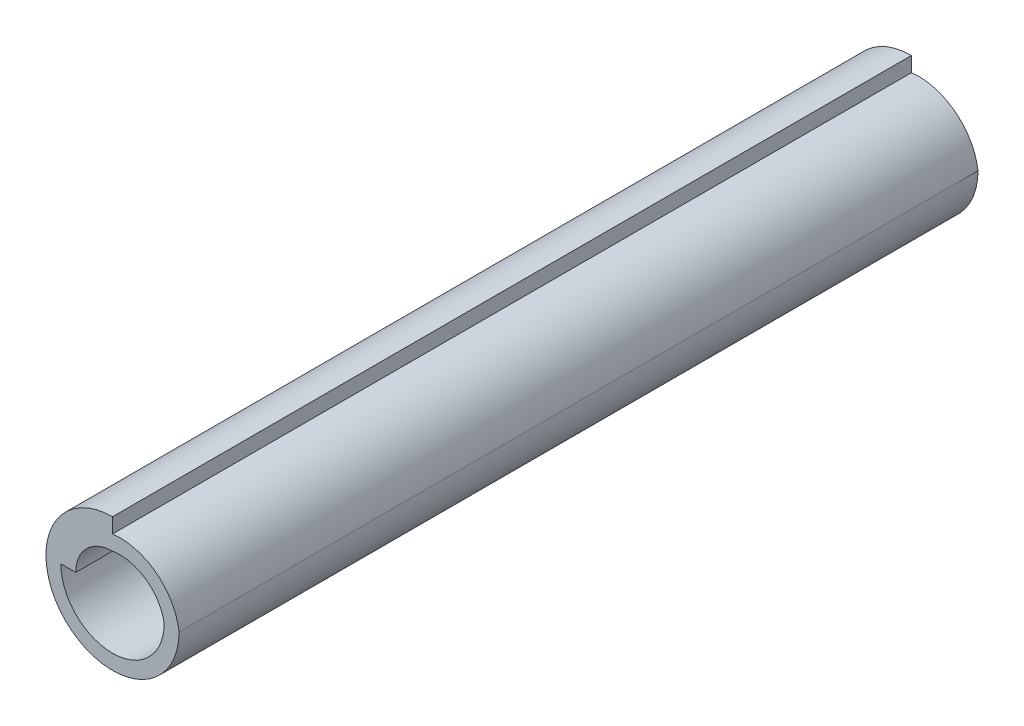
ISO-10303-21;
HEADER;
FILE_DESCRIPTION(('STEP AP214'),'2;1');
FILE_NAME('part.step','',(''),(''),'','','');
FILE_SCHEMA(('AUTOMOTIVE_DESIGN { 1 0 10303 214 1 1 1 1 }'));
ENDSEC;
DATA;
#1=APPLICATION_CONTEXT('core data for automotive mechanical design processes');
#2=APPLICATION_PROTOCOL_DEFINITION('international standard','automotive_design',2000,#1);
#3=PRODUCT_CONTEXT('',#1,'mechanical');
#4=PRODUCT('Part','Part','',(#3));
#5=PRODUCT_RELATED_PRODUCT_CATEGORY('part','',(#4));
#6=PRODUCT_DEFINITION_FORMATION('','',#4);
#7=PRODUCT_DEFINITION_CONTEXT('part definition',#1,'design');
#8=PRODUCT_DEFINITION('design','',#6,#7);
#9=PRODUCT_DEFINITION_SHAPE('','',#8);
#10=(LENGTH_UNIT() NAMED_UNIT(*) SI_UNIT(.MILLI.,.METRE.));
#11=(NAMED_UNIT(*) PLANE_ANGLE_UNIT() SI_UNIT($,.RADIAN.));
#12=(NAMED_UNIT(*) SI_UNIT($,.STERADIAN.) SOLID_ANGLE_UNIT());
#13=UNCERTAINTY_MEASURE_WITH_UNIT(LENGTH_MEASURE(1.E-05),#10,'distance_accuracy_value','');
#14=(GEOMETRIC_REPRESENTATION_CONTEXT(3) GLOBAL_UNCERTAINTY_ASSIGNED_CONTEXT((#13)) GLOBAL_UNIT_ASSIGNED_CONTEXT((#10,
#11,#12)) REPRESENTATION_CONTEXT('',''));
#15=CARTESIAN_POINT('',(0.,0.,0.));
#16=DIRECTION('',(0.,0.,1.));
#17=DIRECTION('',(1.,0.,0.));
#18=AXIS2_PLACEMENT_3D('',#15,#16,#17);
#19=CARTESIAN_POINT('',(0.280000000000001,-0.279999999999999,15.));
#20=DIRECTION('',(0.,0.,1.));
#21=DIRECTION('',(1.,0.,0.));
#22=AXIS2_PLACEMENT_3D('',#19,#20,#21);
#23=PLANE('',#22);
#24=CARTESIAN_POINT('',(0.280000000000001,-0.279999999999999,15.));
#25=DIRECTION('',(0.,0.,1.));
#26=DIRECTION('',(1.,0.,0.));
#27=AXIS2_PLACEMENT_3D('',#24,#25,#26);
#28=CIRCLE('',#27,2.23758798709682);
#29=CARTESIAN_POINT('',(2.5,0.,15.));
#30=VERTEX_POINT('',#29);
#31=CARTESIAN_POINT('',(0.,1.94,15.));
#32=VERTEX_POINT('',#31);
#33=EDGE_CURVE('E127',#30,#32,#28,.T.);
#34=ORIENTED_EDGE('',*,*,#33,.T.);
#35=DIRECTION('',(0.,1.,0.));
#36=VECTOR('',#35,1.);
#37=CARTESIAN_POINT('',(0.,1.94,15.));
#38=LINE('',#37,#36);
#39=CARTESIAN_POINT('',(0.,2.5,15.));
#40=VERTEX_POINT('',#39);
#41=EDGE_CURVE('E130',#32,#40,#38,.T.);
#42=ORIENTED_EDGE('',*,*,#41,.T.);
#43=CARTESIAN_POINT('',(0.,0.,15.));
#44=DIRECTION('',(0.,0.,1.));
#45=DIRECTION('',(1.,0.,0.));
#46=AXIS2_PLACEMENT_3D('',#43,#44,#45);
#47=CIRCLE('',#46,2.5);
#48=EDGE_CURVE('E133',#40,#30,#47,.T.);
#49=ORIENTED_EDGE('',*,*,#48,.T.);
#50=EDGE_LOOP('',(#34,#42,#49));
#51=FACE_BOUND('',#50,.T.);
#52=CARTESIAN_POINT('',(0.280000000000001,-0.279999999999999,15.));
#53=DIRECTION('',(0.,0.,1.));
#54=DIRECTION('',(1.,0.,0.));
#55=AXIS2_PLACEMENT_3D('',#52,#53,#54);
#56=CIRCLE('',#55,1.68344884092152);
#57=CARTESIAN_POINT('',(1.94,0.,15.));
#58=VERTEX_POINT('',#57);
#59=CARTESIAN_POINT('',(0.,1.38,15.));
#60=VERTEX_POINT('',#59);
#61=EDGE_CURVE('E99',#58,#60,#56,.T.);
#62=ORIENTED_EDGE('',*,*,#61,.F.);
#63=CARTESIAN_POINT('',(0.,0.,15.));
#64=DIRECTION('',(0.,0.,1.));
#65=DIRECTION('',(1.,0.,0.));
#66=AXIS2_PLACEMENT_3D('',#63,#64,#65);
#67=CIRCLE('',#66,1.94);
#68=CARTESIAN_POINT('',(-1.94,0.,15.));
#69=VERTEX_POINT('',#68);
#70=EDGE_CURVE('E91',#69,#58,#67,.T.);
#71=ORIENTED_EDGE('',*,*,#70,.F.);
#72=DIRECTION('',(-1.,0.,0.));
#73=VECTOR('',#72,1.);
#74=CARTESIAN_POINT('',(-1.94,0.,15.));
#75=LINE('',#74,#73);
#76=CARTESIAN_POINT('',(-1.38,0.,15.));
#77=VERTEX_POINT('',#76);
#78=EDGE_CURVE('E113',#77,#69,#75,.T.);
#79=ORIENTED_EDGE('',*,*,#78,.F.);
#80=CARTESIAN_POINT('',(0.,0.,15.));
#81=DIRECTION('',(0.,0.,1.));
#82=DIRECTION('',(1.,0.,0.));
#83=AXIS2_PLACEMENT_3D('',#80,#81,#82);
#84=CIRCLE('',#83,1.38);
#85=EDGE_CURVE('E111',#60,#77,#84,.T.);
#86=ORIENTED_EDGE('',*,*,#85,.F.);
#87=EDGE_LOOP('',(#62,#71,#79,#86));
#88=FACE_BOUND('',#87,.T.);
#89=ADVANCED_FACE('F32',(#51,#88),#23,.T.);
#90=CARTESIAN_POINT('',(0.280000000000001,-0.279999999999999,-15.));
#91=DIRECTION('',(0.,0.,1.));
#92=DIRECTION('',(1.,0.,0.));
#93=AXIS2_PLACEMENT_3D('',#90,#91,#92);
#94=PLANE('',#93);
#95=CARTESIAN_POINT('',(0.280000000000001,-0.279999999999999,-15.));
#96=DIRECTION('',(0.,0.,1.));
#97=DIRECTION('',(1.,0.,0.));
#98=AXIS2_PLACEMENT_3D('',#95,#96,#97);
#99=CIRCLE('',#98,2.23758798709682);
#100=CARTESIAN_POINT('',(2.5,0.,-15.));
#101=VERTEX_POINT('',#100);
#102=CARTESIAN_POINT('',(0.,1.94,-15.));
#103=VERTEX_POINT('',#102);
#104=EDGE_CURVE('E107',#101,#103,#99,.T.);
#105=ORIENTED_EDGE('',*,*,#104,.F.);
#106=CARTESIAN_POINT('',(0.,0.,-15.));
#107=DIRECTION('',(0.,0.,1.));
#108=DIRECTION('',(1.,0.,0.));
#109=AXIS2_PLACEMENT_3D('',#106,#107,#108);
#110=CIRCLE('',#109,2.5);
#111=CARTESIAN_POINT('',(0.,2.5,-15.));
#112=VERTEX_POINT('',#111);
#113=EDGE_CURVE('E131',#112,#101,#110,.T.);
#114=ORIENTED_EDGE('',*,*,#113,.F.);
#115=DIRECTION('',(0.,1.,0.));
#116=VECTOR('',#115,1.);
#117=CARTESIAN_POINT('',(0.,1.94,-15.));
#118=LINE('',#117,#116);
#119=EDGE_CURVE('E138',#103,#112,#118,.T.);
#120=ORIENTED_EDGE('',*,*,#119,.F.);
#121=EDGE_LOOP('',(#105,#114,#120));
#122=FACE_BOUND('',#121,.T.);
#123=CARTESIAN_POINT('',(0.,0.,-15.));
#124=DIRECTION('',(0.,0.,1.));
#125=DIRECTION('',(1.,0.,0.));
#126=AXIS2_PLACEMENT_3D('',#123,#124,#125);
#127=CIRCLE('',#126,1.94);
#128=CARTESIAN_POINT('',(-1.94,0.,-15.));
#129=VERTEX_POINT('',#128);
#130=CARTESIAN_POINT('',(1.94,0.,-15.));
#131=VERTEX_POINT('',#130);
#132=EDGE_CURVE('E55',#129,#131,#127,.T.);
#133=ORIENTED_EDGE('',*,*,#132,.T.);
#134=CARTESIAN_POINT('',(0.280000000000001,-0.279999999999999,-15.));
#135=DIRECTION('',(0.,0.,1.));
#136=DIRECTION('',(1.,0.,0.));
#137=AXIS2_PLACEMENT_3D('',#134,#135,#136);
#138=CIRCLE('',#137,1.68344884092152);
#139=CARTESIAN_POINT('',(0.,1.38,-15.));
#140=VERTEX_POINT('',#139);
#141=EDGE_CURVE('E106',#131,#140,#138,.T.);
#142=ORIENTED_EDGE('',*,*,#141,.T.);
#143=CARTESIAN_POINT('',(0.,0.,-15.));
#144=DIRECTION('',(0.,0.,1.));
#145=DIRECTION('',(1.,0.,0.));
#146=AXIS2_PLACEMENT_3D('',#143,#144,#145);
#147=CIRCLE('',#146,1.38);
#148=CARTESIAN_POINT('',(-1.38,0.,-15.));
#149=VERTEX_POINT('',#148);
#150=EDGE_CURVE('E119',#140,#149,#147,.T.);
#151=ORIENTED_EDGE('',*,*,#150,.T.);
#152=DIRECTION('',(-1.,0.,0.));
#153=VECTOR('',#152,1.);
#154=CARTESIAN_POINT('',(-1.94,0.,-15.));
#155=LINE('',#154,#153);
#156=EDGE_CURVE('E100',#149,#129,#155,.T.);
#157=ORIENTED_EDGE('',*,*,#156,.T.);
#158=EDGE_LOOP('',(#133,#142,#151,#157));
#159=FACE_BOUND('',#158,.T.);
#160=ADVANCED_FACE('F152',(#122,#159),#94,.F.);
#161=CARTESIAN_POINT('',(0.280000000000001,-0.279999999999999,15.));
#162=DIRECTION('',(0.,0.,-1.));
#163=DIRECTION('',(-1.,0.,0.));
#164=AXIS2_PLACEMENT_3D('',#161,#162,#163);
#165=CYLINDRICAL_SURFACE('',#164,2.23758798709682);
#166=ORIENTED_EDGE('',*,*,#104,.T.);
#167=DIRECTION('',(0.,0.,-1.));
#168=VECTOR('',#167,1.);
#169=CARTESIAN_POINT('',(0.,1.94,15.));
#170=LINE('',#169,#168);
#171=EDGE_CURVE('E11',#32,#103,#170,.T.);
#172=ORIENTED_EDGE('',*,*,#171,.F.);
#173=ORIENTED_EDGE('',*,*,#33,.F.);
#174=DIRECTION('',(0.,0.,-1.));
#175=VECTOR('',#174,1.);
#176=CARTESIAN_POINT('',(2.5,0.,15.));
#177=LINE('',#176,#175);
#178=EDGE_CURVE('E135',#30,#101,#177,.T.);
#179=ORIENTED_EDGE('',*,*,#178,.T.);
#180=EDGE_LOOP('',(#166,#172,#173,#179));
#181=FACE_BOUND('',#180,.T.);
#182=ADVANCED_FACE('F34',(#181),#165,.T.);
#183=CARTESIAN_POINT('',(0.,1.94,15.));
#184=DIRECTION('',(-1.,0.,0.));
#185=DIRECTION('',(0.,0.,1.));
#186=AXIS2_PLACEMENT_3D('',#183,#184,#185);
#187=PLANE('',#186);
#188=ORIENTED_EDGE('',*,*,#119,.T.);
#189=DIRECTION('',(0.,0.,-1.));
#190=VECTOR('',#189,1.);
#191=CARTESIAN_POINT('',(0.,2.5,15.));
#192=LINE('',#191,#190);
#193=EDGE_CURVE('E40',#40,#112,#192,.T.);
#194=ORIENTED_EDGE('',*,*,#193,.F.);
#195=ORIENTED_EDGE('',*,*,#41,.F.);
#196=ORIENTED_EDGE('',*,*,#171,.T.);
#197=EDGE_LOOP('',(#188,#194,#195,#196));
#198=FACE_BOUND('',#197,.T.);
#199=ADVANCED_FACE('F158',(#198),#187,.F.);
#200=CARTESIAN_POINT('',(0.,0.,15.));
#201=DIRECTION('',(0.,0.,-1.));
#202=DIRECTION('',(-1.,0.,0.));
#203=AXIS2_PLACEMENT_3D('',#200,#201,#202);
#204=CYLINDRICAL_SURFACE('',#203,2.5);
#205=ORIENTED_EDGE('',*,*,#113,.T.);
#206=ORIENTED_EDGE('',*,*,#178,.F.);
#207=ORIENTED_EDGE('',*,*,#48,.F.);
#208=ORIENTED_EDGE('',*,*,#193,.T.);
#209=EDGE_LOOP('',(#205,#206,#207,#208));
#210=FACE_BOUND('',#209,.T.);
#211=ADVANCED_FACE('F147',(#210),#204,.T.);
#212=CARTESIAN_POINT('',(0.,0.,15.));
#213=DIRECTION('',(0.,0.,-1.));
#214=DIRECTION('',(-1.,0.,0.));
#215=AXIS2_PLACEMENT_3D('',#212,#213,#214);
#216=CYLINDRICAL_SURFACE('',#215,1.94);
#217=ORIENTED_EDGE('',*,*,#132,.F.);
#218=DIRECTION('',(0.,0.,-1.));
#219=VECTOR('',#218,1.);
#220=CARTESIAN_POINT('',(-1.94,0.,15.));
#221=LINE('',#220,#219);
#222=EDGE_CURVE('E95',#69,#129,#221,.T.);
#223=ORIENTED_EDGE('',*,*,#222,.F.);
#224=ORIENTED_EDGE('',*,*,#70,.T.);
#225=DIRECTION('',(0.,0.,-1.));
#226=VECTOR('',#225,1.);
#227=CARTESIAN_POINT('',(1.94,0.,15.));
#228=LINE('',#227,#226);
#229=EDGE_CURVE('E94',#58,#131,#228,.T.);
#230=ORIENTED_EDGE('',*,*,#229,.T.);
#231=EDGE_LOOP('',(#217,#223,#224,#230));
#232=FACE_BOUND('',#231,.T.);
#233=ADVANCED_FACE('F93',(#232),#216,.F.);
#234=CARTESIAN_POINT('',(0.280000000000001,-0.279999999999999,15.));
#235=DIRECTION('',(0.,0.,-1.));
#236=DIRECTION('',(-1.,0.,0.));
#237=AXIS2_PLACEMENT_3D('',#234,#235,#236);
#238=CYLINDRICAL_SURFACE('',#237,1.68344884092152);
#239=ORIENTED_EDGE('',*,*,#141,.F.);
#240=ORIENTED_EDGE('',*,*,#229,.F.);
#241=ORIENTED_EDGE('',*,*,#61,.T.);
#242=DIRECTION('',(0.,0.,-1.));
#243=VECTOR('',#242,1.);
#244=CARTESIAN_POINT('',(0.,1.38,15.));
#245=LINE('',#244,#243);
#246=EDGE_CURVE('E108',#60,#140,#245,.T.);
#247=ORIENTED_EDGE('',*,*,#246,.T.);
#248=EDGE_LOOP('',(#239,#240,#241,#247));
#249=FACE_BOUND('',#248,.T.);
#250=ADVANCED_FACE('F103',(#249),#238,.F.);
#251=CARTESIAN_POINT('',(0.,0.,15.));
#252=DIRECTION('',(0.,0.,-1.));
#253=DIRECTION('',(-1.,0.,0.));
#254=AXIS2_PLACEMENT_3D('',#251,#252,#253);
#255=CYLINDRICAL_SURFACE('',#254,1.38);
#256=ORIENTED_EDGE('',*,*,#150,.F.);
#257=ORIENTED_EDGE('',*,*,#246,.F.);
#258=ORIENTED_EDGE('',*,*,#85,.T.);
#259=DIRECTION('',(0.,0.,-1.));
#260=VECTOR('',#259,1.);
#261=CARTESIAN_POINT('',(-1.38,0.,15.));
#262=LINE('',#261,#260);
#263=EDGE_CURVE('E47',#77,#149,#262,.T.);
#264=ORIENTED_EDGE('',*,*,#263,.T.);
#265=EDGE_LOOP('',(#256,#257,#258,#264));
#266=FACE_BOUND('',#265,.T.);
#267=ADVANCED_FACE('F176',(#266),#255,.F.);
#268=CARTESIAN_POINT('',(-1.94,0.,15.));
#269=DIRECTION('',(0.,-1.,0.));
#270=DIRECTION('',(0.,0.,-1.));
#271=AXIS2_PLACEMENT_3D('',#268,#269,#270);
#272=PLANE('',#271);
#273=ORIENTED_EDGE('',*,*,#156,.F.);
#274=ORIENTED_EDGE('',*,*,#263,.F.);
#275=ORIENTED_EDGE('',*,*,#78,.T.);
#276=ORIENTED_EDGE('',*,*,#222,.T.);
#277=EDGE_LOOP('',(#273,#274,#275,#276));
#278=FACE_BOUND('',#277,.T.);
#279=ADVANCED_FACE('F179',(#278),#272,.T.);
#280=CLOSED_SHELL('',(#89,#160,#182,#199,#211,#233,#250,#267,#279));
#281=MANIFOLD_SOLID_BREP('B2',#280);
#282=ADVANCED_BREP_SHAPE_REPRESENTATION('',(#18,#281),#14);
#283=SHAPE_DEFINITION_REPRESENTATION(#9,#282);
ENDSEC;
END-ISO-10303-21;
